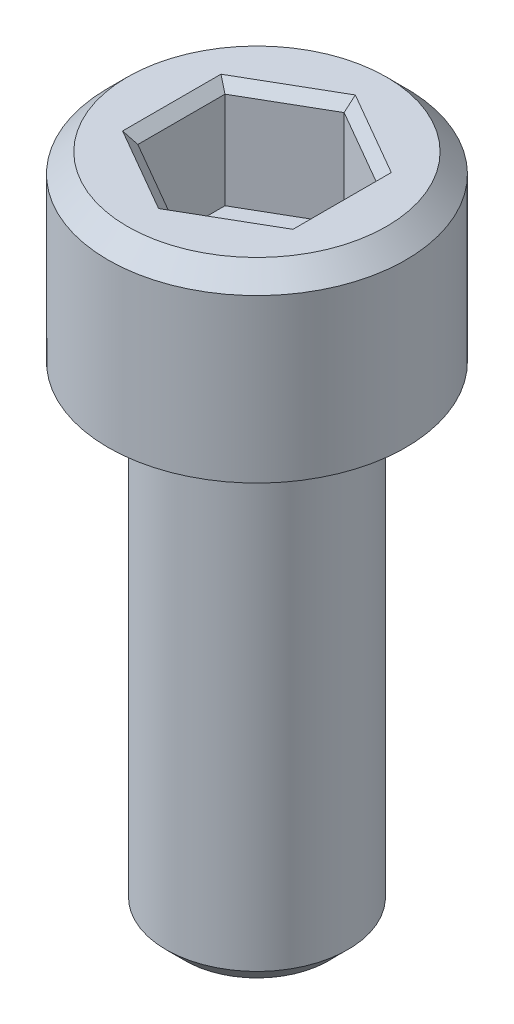
ISO-10303-21;
HEADER;
FILE_DESCRIPTION(('STEP AP214'),'2;1');
FILE_NAME('part.step','',(''),(''),'','','');
FILE_SCHEMA(('AUTOMOTIVE_DESIGN { 1 0 10303 214 1 1 1 1 }'));
ENDSEC;
DATA;
#1=APPLICATION_CONTEXT('core data for automotive mechanical design processes');
#2=APPLICATION_PROTOCOL_DEFINITION('international standard','automotive_design',2000,#1);
#3=PRODUCT_CONTEXT('',#1,'mechanical');
#4=PRODUCT('Part','Part','',(#3));
#5=PRODUCT_RELATED_PRODUCT_CATEGORY('part','',(#4));
#6=PRODUCT_DEFINITION_FORMATION('','',#4);
#7=PRODUCT_DEFINITION_CONTEXT('part definition',#1,'design');
#8=PRODUCT_DEFINITION('design','',#6,#7);
#9=PRODUCT_DEFINITION_SHAPE('','',#8);
#10=(LENGTH_UNIT() NAMED_UNIT(*) SI_UNIT(.MILLI.,.METRE.));
#11=(NAMED_UNIT(*) PLANE_ANGLE_UNIT() SI_UNIT($,.RADIAN.));
#12=(NAMED_UNIT(*) SI_UNIT($,.STERADIAN.) SOLID_ANGLE_UNIT());
#13=UNCERTAINTY_MEASURE_WITH_UNIT(LENGTH_MEASURE(1.E-05),#10,'distance_accuracy_value','');
#14=(GEOMETRIC_REPRESENTATION_CONTEXT(3) GLOBAL_UNCERTAINTY_ASSIGNED_CONTEXT((#13)) GLOBAL_UNIT_ASSIGNED_CONTEXT((#10,
#11,#12)) REPRESENTATION_CONTEXT('',''));
#15=CARTESIAN_POINT('',(0.,0.,0.));
#16=DIRECTION('',(0.,0.,1.));
#17=DIRECTION('',(1.,0.,0.));
#18=AXIS2_PLACEMENT_3D('',#15,#16,#17);
#19=CARTESIAN_POINT('',(0.,-4.77520000000009,0.));
#20=DIRECTION('',(0.,1.,0.));
#21=DIRECTION('',(0.,0.,1.));
#22=AXIS2_PLACEMENT_3D('',#19,#20,#21);
#23=CYLINDRICAL_SURFACE('',#22,3.9116);
#24=CARTESIAN_POINT('',(0.,-0.507999999965141,0.));
#25=DIRECTION('',(0.,1.,0.));
#26=DIRECTION('',(0.,0.,1.));
#27=AXIS2_PLACEMENT_3D('',#24,#25,#26);
#28=CIRCLE('',#27,3.9116);
#29=CARTESIAN_POINT('',(0.,-0.507999999965141,3.9116));
#30=VERTEX_POINT('',#29);
#31=EDGE_CURVE('E162',#30,#30,#28,.F.);
#32=ORIENTED_EDGE('',*,*,#31,.T.);
#33=EDGE_LOOP('',(#32));
#34=FACE_BOUND('',#33,.T.);
#35=CARTESIAN_POINT('',(0.,-4.77520000000009,0.));
#36=DIRECTION('',(0.,1.,0.));
#37=DIRECTION('',(0.,0.,1.));
#38=AXIS2_PLACEMENT_3D('',#35,#36,#37);
#39=CIRCLE('',#38,3.9116);
#40=CARTESIAN_POINT('',(0.,-4.77520000000009,3.9116));
#41=VERTEX_POINT('',#40);
#42=EDGE_CURVE('E138',#41,#41,#39,.T.);
#43=ORIENTED_EDGE('',*,*,#42,.T.);
#44=EDGE_LOOP('',(#43));
#45=FACE_BOUND('',#44,.T.);
#46=ADVANCED_FACE('F32',(#34,#45),#23,.T.);
#47=CARTESIAN_POINT('',(-3.9116,-4.77520000000009,0.));
#48=DIRECTION('',(0.,-1.,0.));
#49=DIRECTION('',(0.,0.,-1.));
#50=AXIS2_PLACEMENT_3D('',#47,#48,#49);
#51=PLANE('',#50);
#52=CARTESIAN_POINT('',(0.,-4.77520000000009,0.));
#53=DIRECTION('',(0.,-1.,0.));
#54=DIRECTION('',(0.,0.,-1.));
#55=AXIS2_PLACEMENT_3D('',#52,#53,#54);
#56=CIRCLE('',#55,2.3876);
#57=CARTESIAN_POINT('',(0.,-4.77520000000009,-2.3876));
#58=VERTEX_POINT('',#57);
#59=EDGE_CURVE('E148',#58,#58,#56,.T.);
#60=ORIENTED_EDGE('',*,*,#59,.F.);
#61=EDGE_LOOP('',(#60));
#62=FACE_BOUND('',#61,.T.);
#63=ORIENTED_EDGE('',*,*,#42,.F.);
#64=EDGE_LOOP('',(#63));
#65=FACE_BOUND('',#64,.T.);
#66=ADVANCED_FACE('F236',(#62,#65),#51,.T.);
#67=CARTESIAN_POINT('',(0.,0.,0.));
#68=DIRECTION('',(0.,1.,0.));
#69=DIRECTION('',(0.,0.,1.));
#70=AXIS2_PLACEMENT_3D('',#67,#68,#69);
#71=PLANE('',#70);
#72=DIRECTION('',(-0.866025403784438,0.,0.500000000000001));
#73=VECTOR('',#72,1.);
#74=CARTESIAN_POINT('',(0.126999999999998,0.,2.51132933256124));
#75=LINE('',#74,#73);
#76=CARTESIAN_POINT('',(2.23837499926705,0.,1.29232640837416));
#77=VERTEX_POINT('',#76);
#78=CARTESIAN_POINT('',(0.,0.,2.58465281674832));
#79=VERTEX_POINT('',#78);
#80=EDGE_CURVE('E176',#77,#79,#75,.T.);
#81=ORIENTED_EDGE('',*,*,#80,.T.);
#82=DIRECTION('',(-0.866025403784439,0.,-0.5));
#83=VECTOR('',#82,1.);
#84=CARTESIAN_POINT('',(-2.11137499926705,0.,1.36564989256124));
#85=LINE('',#84,#83);
#86=CARTESIAN_POINT('',(-2.23837499926705,0.,1.29232640837416));
#87=VERTEX_POINT('',#86);
#88=EDGE_CURVE('E178',#79,#87,#85,.T.);
#89=ORIENTED_EDGE('',*,*,#88,.T.);
#90=DIRECTION('',(0.,0.,-1.));
#91=VECTOR('',#90,1.);
#92=CARTESIAN_POINT('',(-2.23837499926705,0.,-1.14567944));
#93=LINE('',#92,#91);
#94=CARTESIAN_POINT('',(-2.23837499926705,0.,-1.29232640837416));
#95=VERTEX_POINT('',#94);
#96=EDGE_CURVE('E168',#87,#95,#93,.T.);
#97=ORIENTED_EDGE('',*,*,#96,.T.);
#98=DIRECTION('',(0.866025403784439,0.,-0.5));
#99=VECTOR('',#98,1.);
#100=CARTESIAN_POINT('',(-0.126999999999996,0.,-2.51132933256124));
#101=LINE('',#100,#99);
#102=CARTESIAN_POINT('',(0.,0.,-2.58465281674832));
#103=VERTEX_POINT('',#102);
#104=EDGE_CURVE('E170',#95,#103,#101,.T.);
#105=ORIENTED_EDGE('',*,*,#104,.T.);
#106=DIRECTION('',(0.866025403784439,0.,0.5));
#107=VECTOR('',#106,1.);
#108=CARTESIAN_POINT('',(2.11137499926706,0.,-1.36564989256124));
#109=LINE('',#108,#107);
#110=CARTESIAN_POINT('',(2.23837499926705,0.,-1.29232640837416));
#111=VERTEX_POINT('',#110);
#112=EDGE_CURVE('E172',#103,#111,#109,.T.);
#113=ORIENTED_EDGE('',*,*,#112,.T.);
#114=DIRECTION('',(0.,0.,1.));
#115=VECTOR('',#114,1.);
#116=CARTESIAN_POINT('',(2.23837499926705,0.,1.14567944));
#117=LINE('',#116,#115);
#118=EDGE_CURVE('E174',#111,#77,#117,.T.);
#119=ORIENTED_EDGE('',*,*,#118,.T.);
#120=EDGE_LOOP('',(#81,#89,#97,#105,#113,#119));
#121=FACE_BOUND('',#120,.T.);
#122=CARTESIAN_POINT('',(0.,0.,0.));
#123=DIRECTION('',(0.,1.,0.));
#124=DIRECTION('',(0.,0.,1.));
#125=AXIS2_PLACEMENT_3D('',#122,#123,#124);
#126=CIRCLE('',#125,3.40360000003486);
#127=CARTESIAN_POINT('',(0.,0.,3.40360000003486));
#128=VERTEX_POINT('',#127);
#129=EDGE_CURVE('E159',#128,#128,#126,.T.);
#130=ORIENTED_EDGE('',*,*,#129,.T.);
#131=EDGE_LOOP('',(#130));
#132=FACE_BOUND('',#131,.T.);
#133=ADVANCED_FACE('F242',(#121,#132),#71,.T.);
#134=CARTESIAN_POINT('',(0.,-17.4752000000001,0.));
#135=DIRECTION('',(0.,1.,0.));
#136=DIRECTION('',(0.,0.,1.));
#137=AXIS2_PLACEMENT_3D('',#134,#135,#136);
#138=CYLINDRICAL_SURFACE('',#137,2.3876);
#139=CARTESIAN_POINT('',(0.,-16.9672000000349,0.));
#140=DIRECTION('',(0.,-1.,0.));
#141=DIRECTION('',(0.,0.,-1.));
#142=AXIS2_PLACEMENT_3D('',#139,#140,#141);
#143=CIRCLE('',#142,2.3876);
#144=CARTESIAN_POINT('',(0.,-16.9672000000349,-2.3876));
#145=VERTEX_POINT('',#144);
#146=EDGE_CURVE('E156',#145,#145,#143,.F.);
#147=ORIENTED_EDGE('',*,*,#146,.T.);
#148=EDGE_LOOP('',(#147));
#149=FACE_BOUND('',#148,.T.);
#150=ORIENTED_EDGE('',*,*,#59,.T.);
#151=EDGE_LOOP('',(#150));
#152=FACE_BOUND('',#151,.T.);
#153=ADVANCED_FACE('F330',(#149,#152),#138,.T.);
#154=CARTESIAN_POINT('',(0.,-17.4752000000001,0.));
#155=DIRECTION('',(0.,-1.,0.));
#156=DIRECTION('',(0.,0.,-1.));
#157=AXIS2_PLACEMENT_3D('',#154,#155,#156);
#158=PLANE('',#157);
#159=CARTESIAN_POINT('',(0.,-17.4752000000001,0.));
#160=DIRECTION('',(0.,-1.,0.));
#161=DIRECTION('',(0.,0.,-1.));
#162=AXIS2_PLACEMENT_3D('',#159,#160,#161);
#163=CIRCLE('',#162,1.87960000003486);
#164=CARTESIAN_POINT('',(0.,-17.4752000000001,-1.87960000003486));
#165=VERTEX_POINT('',#164);
#166=EDGE_CURVE('E151',#165,#165,#163,.T.);
#167=ORIENTED_EDGE('',*,*,#166,.T.);
#168=EDGE_LOOP('',(#167));
#169=FACE_BOUND('',#168,.T.);
#170=ADVANCED_FACE('F232',(#169),#158,.T.);
#171=CARTESIAN_POINT('',(0.,-2.79399999999996,-2.29135888));
#172=DIRECTION('',(-0.5,0.,-0.866025403784439));
#173=DIRECTION('',(-0.866025403784439,0.,0.5));
#174=AXIS2_PLACEMENT_3D('',#171,#172,#173);
#175=PLANE('',#174);
#176=DIRECTION('',(0.,1.,0.));
#177=VECTOR('',#176,1.);
#178=CARTESIAN_POINT('',(0.,-2.79399999999996,-2.29135888));
#179=LINE('',#178,#177);
#180=CARTESIAN_POINT('',(0.,-2.79399999999996,-2.29135888));
#181=VERTEX_POINT('',#180);
#182=CARTESIAN_POINT('',(0.,-0.253999999999987,-2.29135888));
#183=VERTEX_POINT('',#182);
#184=EDGE_CURVE('E136',#181,#183,#179,.T.);
#185=ORIENTED_EDGE('',*,*,#184,.T.);
#186=DIRECTION('',(-0.866025403784439,0.,0.5));
#187=VECTOR('',#186,1.);
#188=CARTESIAN_POINT('',(-1.98437499926706,-0.253999999999987,-1.14567944));
#189=LINE('',#188,#187);
#190=CARTESIAN_POINT('',(-1.98437499926706,-0.253999999999987,-1.14567944));
#191=VERTEX_POINT('',#190);
#192=EDGE_CURVE('E41',#183,#191,#189,.T.);
#193=ORIENTED_EDGE('',*,*,#192,.T.);
#194=DIRECTION('',(0.,1.,0.));
#195=VECTOR('',#194,1.);
#196=CARTESIAN_POINT('',(-1.98437499926706,-2.79399999999996,-1.14567944));
#197=LINE('',#196,#195);
#198=CARTESIAN_POINT('',(-1.98437499926706,-2.79399999999996,-1.14567944));
#199=VERTEX_POINT('',#198);
#200=EDGE_CURVE('E102',#199,#191,#197,.T.);
#201=ORIENTED_EDGE('',*,*,#200,.F.);
#202=DIRECTION('',(-0.866025403784439,0.,0.5));
#203=VECTOR('',#202,1.);
#204=CARTESIAN_POINT('',(0.,-2.79399999999996,-2.29135888));
#205=LINE('',#204,#203);
#206=EDGE_CURVE('E106',#181,#199,#205,.T.);
#207=ORIENTED_EDGE('',*,*,#206,.F.);
#208=EDGE_LOOP('',(#185,#193,#201,#207));
#209=FACE_BOUND('',#208,.T.);
#210=ADVANCED_FACE('F104',(#209),#175,.F.);
#211=CARTESIAN_POINT('',(1.98437499926706,-2.79399999999996,-1.14567944));
#212=DIRECTION('',(0.5,0.,-0.866025403784439));
#213=DIRECTION('',(-0.866025403784439,0.,-0.5));
#214=AXIS2_PLACEMENT_3D('',#211,#212,#213);
#215=PLANE('',#214);
#216=DIRECTION('',(0.,1.,0.));
#217=VECTOR('',#216,1.);
#218=CARTESIAN_POINT('',(1.98437499926706,-2.79399999999996,-1.14567944));
#219=LINE('',#218,#217);
#220=CARTESIAN_POINT('',(1.98437499926706,-2.79399999999996,-1.14567944));
#221=VERTEX_POINT('',#220);
#222=CARTESIAN_POINT('',(1.98437499926706,-0.253999999999987,-1.14567944));
#223=VERTEX_POINT('',#222);
#224=EDGE_CURVE('E139',#221,#223,#219,.T.);
#225=ORIENTED_EDGE('',*,*,#224,.T.);
#226=DIRECTION('',(-0.866025403784439,0.,-0.5));
#227=VECTOR('',#226,1.);
#228=CARTESIAN_POINT('',(0.,-0.253999999999987,-2.29135888));
#229=LINE('',#228,#227);
#230=EDGE_CURVE('E56',#223,#183,#229,.T.);
#231=ORIENTED_EDGE('',*,*,#230,.T.);
#232=ORIENTED_EDGE('',*,*,#184,.F.);
#233=DIRECTION('',(-0.866025403784439,0.,-0.5));
#234=VECTOR('',#233,1.);
#235=CARTESIAN_POINT('',(1.98437499926706,-2.79399999999996,-1.14567944));
#236=LINE('',#235,#234);
#237=EDGE_CURVE('E111',#221,#181,#236,.T.);
#238=ORIENTED_EDGE('',*,*,#237,.F.);
#239=EDGE_LOOP('',(#225,#231,#232,#238));
#240=FACE_BOUND('',#239,.T.);
#241=ADVANCED_FACE('F224',(#240),#215,.F.);
#242=CARTESIAN_POINT('',(1.98437499926706,-2.79399999999996,1.14567944));
#243=DIRECTION('',(1.,0.,0.));
#244=DIRECTION('',(0.,0.,-1.));
#245=AXIS2_PLACEMENT_3D('',#242,#243,#244);
#246=PLANE('',#245);
#247=DIRECTION('',(0.,1.,0.));
#248=VECTOR('',#247,1.);
#249=CARTESIAN_POINT('',(1.98437499926706,-2.79399999999996,1.14567944));
#250=LINE('',#249,#248);
#251=CARTESIAN_POINT('',(1.98437499926706,-2.79399999999996,1.14567944));
#252=VERTEX_POINT('',#251);
#253=CARTESIAN_POINT('',(1.98437499926706,-0.253999999999987,1.14567944));
#254=VERTEX_POINT('',#253);
#255=EDGE_CURVE('E141',#252,#254,#250,.T.);
#256=ORIENTED_EDGE('',*,*,#255,.T.);
#257=DIRECTION('',(0.,0.,-1.));
#258=VECTOR('',#257,1.);
#259=CARTESIAN_POINT('',(1.98437499926706,-0.253999999999987,-1.14567944));
#260=LINE('',#259,#258);
#261=EDGE_CURVE('E183',#254,#223,#260,.T.);
#262=ORIENTED_EDGE('',*,*,#261,.T.);
#263=ORIENTED_EDGE('',*,*,#224,.F.);
#264=DIRECTION('',(0.,0.,-1.));
#265=VECTOR('',#264,1.);
#266=CARTESIAN_POINT('',(1.98437499926706,-2.79399999999996,1.14567944));
#267=LINE('',#266,#265);
#268=EDGE_CURVE('E133',#252,#221,#267,.T.);
#269=ORIENTED_EDGE('',*,*,#268,.F.);
#270=EDGE_LOOP('',(#256,#262,#263,#269));
#271=FACE_BOUND('',#270,.T.);
#272=ADVANCED_FACE('F223',(#271),#246,.F.);
#273=CARTESIAN_POINT('',(0.,-2.79399999999996,2.29135888));
#274=DIRECTION('',(0.500000000000001,0.,0.866025403784438));
#275=DIRECTION('',(0.866025403784438,0.,-0.500000000000001));
#276=AXIS2_PLACEMENT_3D('',#273,#274,#275);
#277=PLANE('',#276);
#278=DIRECTION('',(0.,1.,0.));
#279=VECTOR('',#278,1.);
#280=CARTESIAN_POINT('',(0.,-2.79399999999996,2.29135888));
#281=LINE('',#280,#279);
#282=CARTESIAN_POINT('',(0.,-2.79399999999996,2.29135888));
#283=VERTEX_POINT('',#282);
#284=CARTESIAN_POINT('',(0.,-0.253999999999987,2.29135888));
#285=VERTEX_POINT('',#284);
#286=EDGE_CURVE('E144',#283,#285,#281,.T.);
#287=ORIENTED_EDGE('',*,*,#286,.T.);
#288=DIRECTION('',(0.866025403784438,0.,-0.500000000000001));
#289=VECTOR('',#288,1.);
#290=CARTESIAN_POINT('',(1.98437499926706,-0.253999999999987,1.14567944));
#291=LINE('',#290,#289);
#292=EDGE_CURVE('E181',#285,#254,#291,.T.);
#293=ORIENTED_EDGE('',*,*,#292,.T.);
#294=ORIENTED_EDGE('',*,*,#255,.F.);
#295=DIRECTION('',(0.866025403784438,0.,-0.500000000000001));
#296=VECTOR('',#295,1.);
#297=CARTESIAN_POINT('',(0.,-2.79399999999996,2.29135888));
#298=LINE('',#297,#296);
#299=EDGE_CURVE('E130',#283,#252,#298,.T.);
#300=ORIENTED_EDGE('',*,*,#299,.F.);
#301=EDGE_LOOP('',(#287,#293,#294,#300));
#302=FACE_BOUND('',#301,.T.);
#303=ADVANCED_FACE('F220',(#302),#277,.F.);
#304=CARTESIAN_POINT('',(-1.98437499926706,-2.79399999999996,1.14567944));
#305=DIRECTION('',(-0.5,0.,0.866025403784439));
#306=DIRECTION('',(0.866025403784439,0.,0.5));
#307=AXIS2_PLACEMENT_3D('',#304,#305,#306);
#308=PLANE('',#307);
#309=DIRECTION('',(0.,1.,0.));
#310=VECTOR('',#309,1.);
#311=CARTESIAN_POINT('',(-1.98437499926706,-2.79399999999996,1.14567944));
#312=LINE('',#311,#310);
#313=CARTESIAN_POINT('',(-1.98437499926706,-2.79399999999996,1.14567944));
#314=VERTEX_POINT('',#313);
#315=CARTESIAN_POINT('',(-1.98437499926706,-0.253999999999987,1.14567944));
#316=VERTEX_POINT('',#315);
#317=EDGE_CURVE('E110',#314,#316,#312,.T.);
#318=ORIENTED_EDGE('',*,*,#317,.T.);
#319=DIRECTION('',(0.866025403784439,0.,0.5));
#320=VECTOR('',#319,1.);
#321=CARTESIAN_POINT('',(0.,-0.253999999999987,2.29135888));
#322=LINE('',#321,#320);
#323=EDGE_CURVE('E165',#316,#285,#322,.T.);
#324=ORIENTED_EDGE('',*,*,#323,.T.);
#325=ORIENTED_EDGE('',*,*,#286,.F.);
#326=DIRECTION('',(0.866025403784439,0.,0.5));
#327=VECTOR('',#326,1.);
#328=CARTESIAN_POINT('',(-1.98437499926706,-2.79399999999996,1.14567944));
#329=LINE('',#328,#327);
#330=EDGE_CURVE('E120',#314,#283,#329,.T.);
#331=ORIENTED_EDGE('',*,*,#330,.F.);
#332=EDGE_LOOP('',(#318,#324,#325,#331));
#333=FACE_BOUND('',#332,.T.);
#334=ADVANCED_FACE('F216',(#333),#308,.F.);
#335=CARTESIAN_POINT('',(-1.98437499926706,-2.79399999999996,-1.14567944));
#336=DIRECTION('',(-1.,0.,0.));
#337=DIRECTION('',(0.,0.,1.));
#338=AXIS2_PLACEMENT_3D('',#335,#336,#337);
#339=PLANE('',#338);
#340=ORIENTED_EDGE('',*,*,#200,.T.);
#341=DIRECTION('',(0.,0.,1.));
#342=VECTOR('',#341,1.);
#343=CARTESIAN_POINT('',(-1.98437499926706,-0.253999999999987,1.14567944));
#344=LINE('',#343,#342);
#345=EDGE_CURVE('E11',#191,#316,#344,.T.);
#346=ORIENTED_EDGE('',*,*,#345,.T.);
#347=ORIENTED_EDGE('',*,*,#317,.F.);
#348=DIRECTION('',(0.,0.,1.));
#349=VECTOR('',#348,1.);
#350=CARTESIAN_POINT('',(-1.98437499926706,-2.79399999999996,-1.14567944));
#351=LINE('',#350,#349);
#352=EDGE_CURVE('E114',#199,#314,#351,.T.);
#353=ORIENTED_EDGE('',*,*,#352,.F.);
#354=EDGE_LOOP('',(#340,#346,#347,#353));
#355=FACE_BOUND('',#354,.T.);
#356=ADVANCED_FACE('F115',(#355),#339,.F.);
#357=CARTESIAN_POINT('',(0.,-2.79399999999996,0.));
#358=DIRECTION('',(0.,1.,0.));
#359=DIRECTION('',(0.,0.,1.));
#360=AXIS2_PLACEMENT_3D('',#357,#358,#359);
#361=PLANE('',#360);
#362=ORIENTED_EDGE('',*,*,#206,.T.);
#363=ORIENTED_EDGE('',*,*,#352,.T.);
#364=ORIENTED_EDGE('',*,*,#330,.T.);
#365=ORIENTED_EDGE('',*,*,#299,.T.);
#366=ORIENTED_EDGE('',*,*,#268,.T.);
#367=ORIENTED_EDGE('',*,*,#237,.T.);
#368=EDGE_LOOP('',(#362,#363,#364,#365,#366,#367));
#369=FACE_BOUND('',#368,.T.);
#370=ADVANCED_FACE('F122',(#369),#361,.T.);
#371=CARTESIAN_POINT('',(0.,-17.4752000000001,0.));
#372=DIRECTION('',(0.,1.,0.));
#373=DIRECTION('',(0.,0.,1.));
#374=AXIS2_PLACEMENT_3D('',#371,#372,#373);
#375=CONICAL_SURFACE('',#374,1.87960000003486,0.785398163397446);
#376=ORIENTED_EDGE('',*,*,#146,.F.);
#377=EDGE_LOOP('',(#376));
#378=FACE_BOUND('',#377,.T.);
#379=ORIENTED_EDGE('',*,*,#166,.F.);
#380=EDGE_LOOP('',(#379));
#381=FACE_BOUND('',#380,.T.);
#382=ADVANCED_FACE('F248',(#378,#381),#375,.T.);
#383=CARTESIAN_POINT('',(0.,0.,0.));
#384=DIRECTION('',(0.,-1.,0.));
#385=DIRECTION('',(0.,0.,-1.));
#386=AXIS2_PLACEMENT_3D('',#383,#384,#385);
#387=CONICAL_SURFACE('',#386,3.40360000003486,0.785398163397444);
#388=ORIENTED_EDGE('',*,*,#31,.F.);
#389=EDGE_LOOP('',(#388));
#390=FACE_BOUND('',#389,.T.);
#391=ORIENTED_EDGE('',*,*,#129,.F.);
#392=EDGE_LOOP('',(#391));
#393=FACE_BOUND('',#392,.T.);
#394=ADVANCED_FACE('F251',(#390,#393),#387,.T.);
#395=CARTESIAN_POINT('',(1.98437499926706,-0.253999999999987,-1.14567944));
#396=DIRECTION('',(-0.353553390593271,0.707106781186552,0.61237243569579));
#397=DIRECTION('',(0.866025403784439,0.,0.5));
#398=AXIS2_PLACEMENT_3D('',#395,#396,#397);
#399=PLANE('',#398);
#400=DIRECTION('',(0.65465367070798,0.654653670707972,-0.377964473009231));
#401=VECTOR('',#400,1.);
#402=CARTESIAN_POINT('',(1.41741071376218,-0.820964285504862,-0.818342457142852));
#403=LINE('',#402,#401);
#404=EDGE_CURVE('E127',#111,#223,#403,.F.);
#405=ORIENTED_EDGE('',*,*,#404,.F.);
#406=ORIENTED_EDGE('',*,*,#112,.F.);
#407=DIRECTION('',(0.,0.654653670707972,-0.755928946018459));
#408=VECTOR('',#407,1.);
#409=CARTESIAN_POINT('',(0.,-0.820964285504862,-1.6366849142857));
#410=LINE('',#409,#408);
#411=EDGE_CURVE('E36',#183,#103,#410,.T.);
#412=ORIENTED_EDGE('',*,*,#411,.F.);
#413=ORIENTED_EDGE('',*,*,#230,.F.);
#414=EDGE_LOOP('',(#405,#406,#412,#413));
#415=FACE_BOUND('',#414,.T.);
#416=ADVANCED_FACE('F34',(#415),#399,.T.);
#417=CARTESIAN_POINT('',(0.,-0.253999999999987,-2.29135888));
#418=DIRECTION('',(0.353553390593271,0.707106781186553,0.61237243569579));
#419=DIRECTION('',(0.866025403784439,0.,-0.5));
#420=AXIS2_PLACEMENT_3D('',#417,#418,#419);
#421=PLANE('',#420);
#422=ORIENTED_EDGE('',*,*,#411,.T.);
#423=ORIENTED_EDGE('',*,*,#104,.F.);
#424=DIRECTION('',(-0.654653670707981,0.654653670707972,-0.377964473009231));
#425=VECTOR('',#424,1.);
#426=CARTESIAN_POINT('',(-1.41741071376218,-0.820964285504858,-0.818342457142853));
#427=LINE('',#426,#425);
#428=EDGE_CURVE('E194',#191,#95,#427,.T.);
#429=ORIENTED_EDGE('',*,*,#428,.F.);
#430=ORIENTED_EDGE('',*,*,#192,.F.);
#431=EDGE_LOOP('',(#422,#423,#429,#430));
#432=FACE_BOUND('',#431,.T.);
#433=ADVANCED_FACE('F208',(#432),#421,.T.);
#434=CARTESIAN_POINT('',(1.98437499926706,-0.253999999999987,1.14567944));
#435=DIRECTION('',(-0.707106781186544,0.707106781186551,0.));
#436=DIRECTION('',(0.,0.,1.));
#437=AXIS2_PLACEMENT_3D('',#434,#435,#436);
#438=PLANE('',#437);
#439=ORIENTED_EDGE('',*,*,#404,.T.);
#440=ORIENTED_EDGE('',*,*,#261,.F.);
#441=DIRECTION('',(0.65465367070798,0.654653670707973,0.377964473009231));
#442=VECTOR('',#441,1.);
#443=CARTESIAN_POINT('',(1.41741071376218,-0.820964285504856,0.818342457142854));
#444=LINE('',#443,#442);
#445=EDGE_CURVE('E191',#77,#254,#444,.F.);
#446=ORIENTED_EDGE('',*,*,#445,.F.);
#447=ORIENTED_EDGE('',*,*,#118,.F.);
#448=EDGE_LOOP('',(#439,#440,#446,#447));
#449=FACE_BOUND('',#448,.T.);
#450=ADVANCED_FACE('F201',(#449),#438,.T.);
#451=CARTESIAN_POINT('',(-1.98437499926706,-0.253999999999987,-1.14567944));
#452=DIRECTION('',(0.707106781186543,0.707106781186552,0.));
#453=DIRECTION('',(0.,0.,-1.));
#454=AXIS2_PLACEMENT_3D('',#451,#452,#453);
#455=PLANE('',#454);
#456=ORIENTED_EDGE('',*,*,#428,.T.);
#457=ORIENTED_EDGE('',*,*,#96,.F.);
#458=DIRECTION('',(0.654653670707981,-0.654653670707972,-0.37796447300923));
#459=VECTOR('',#458,1.);
#460=CARTESIAN_POINT('',(-1.98437499926706,-0.253999999999987,1.14567944));
#461=LINE('',#460,#459);
#462=EDGE_CURVE('E189',#316,#87,#461,.F.);
#463=ORIENTED_EDGE('',*,*,#462,.F.);
#464=ORIENTED_EDGE('',*,*,#345,.F.);
#465=EDGE_LOOP('',(#456,#457,#463,#464));
#466=FACE_BOUND('',#465,.T.);
#467=ADVANCED_FACE('F213',(#466),#455,.T.);
#468=CARTESIAN_POINT('',(0.,-0.253999999999987,2.29135888));
#469=DIRECTION('',(-0.353553390593272,0.707106781186553,-0.61237243569579));
#470=DIRECTION('',(-0.866025403784438,0.,0.500000000000001));
#471=AXIS2_PLACEMENT_3D('',#468,#469,#470);
#472=PLANE('',#471);
#473=ORIENTED_EDGE('',*,*,#445,.T.);
#474=ORIENTED_EDGE('',*,*,#292,.F.);
#475=DIRECTION('',(0.,0.654653670707972,0.755928946018459));
#476=VECTOR('',#475,1.);
#477=CARTESIAN_POINT('',(0.,-0.820964285504861,1.63668491428571));
#478=LINE('',#477,#476);
#479=EDGE_CURVE('E187',#79,#285,#478,.F.);
#480=ORIENTED_EDGE('',*,*,#479,.F.);
#481=ORIENTED_EDGE('',*,*,#80,.F.);
#482=EDGE_LOOP('',(#473,#474,#480,#481));
#483=FACE_BOUND('',#482,.T.);
#484=ADVANCED_FACE('F259',(#483),#472,.T.);
#485=CARTESIAN_POINT('',(-1.98437499926706,-0.253999999999987,1.14567944));
#486=DIRECTION('',(0.353553390593271,0.707106781186553,-0.61237243569579));
#487=DIRECTION('',(-0.866025403784439,0.,-0.5));
#488=AXIS2_PLACEMENT_3D('',#485,#486,#487);
#489=PLANE('',#488);
#490=ORIENTED_EDGE('',*,*,#462,.T.);
#491=ORIENTED_EDGE('',*,*,#88,.F.);
#492=ORIENTED_EDGE('',*,*,#479,.T.);
#493=ORIENTED_EDGE('',*,*,#323,.F.);
#494=EDGE_LOOP('',(#490,#491,#492,#493));
#495=FACE_BOUND('',#494,.T.);
#496=ADVANCED_FACE('F256',(#495),#489,.T.);
#497=CLOSED_SHELL('',(#46,#66,#133,#153,#170,#210,#241,#272,#303,#334,#356,#370,#382,#394,#416,
#433,#450,#467,#484,#496));
#498=MANIFOLD_SOLID_BREP('B2',#497);
#499=ADVANCED_BREP_SHAPE_REPRESENTATION('',(#18,#498),#14);
#500=SHAPE_DEFINITION_REPRESENTATION(#9,#499);
ENDSEC;
END-ISO-10303-21;
